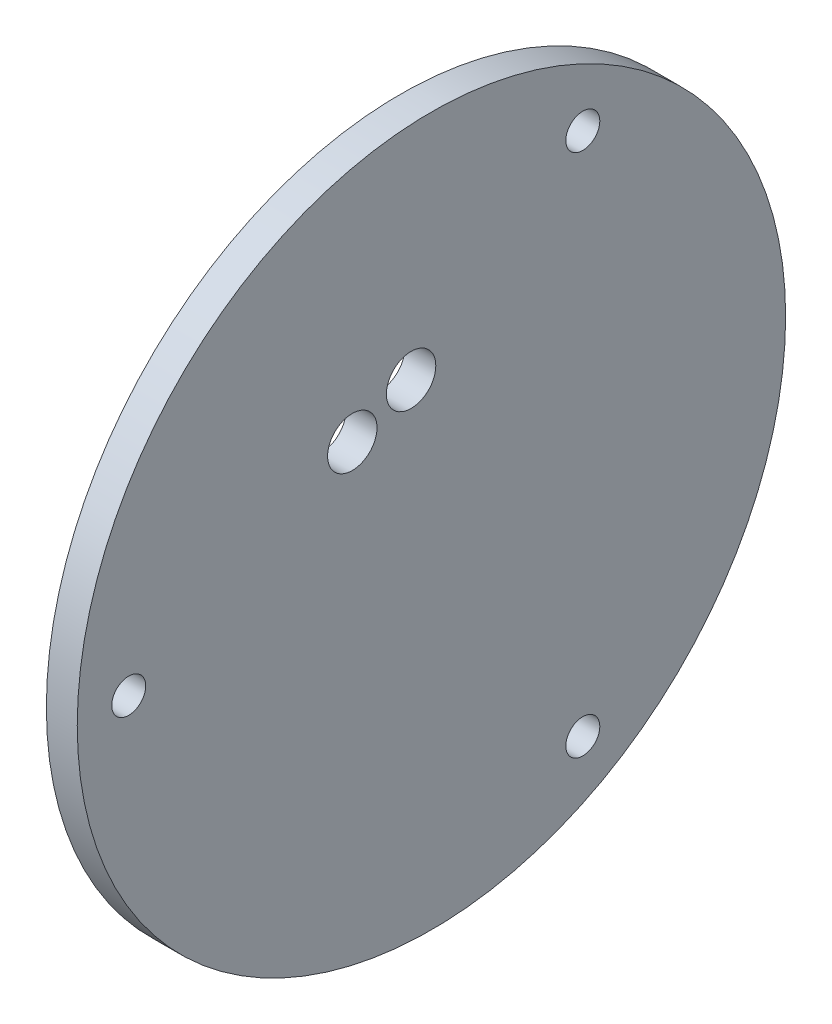
ISO-10303-21;
HEADER;
FILE_DESCRIPTION(('STEP AP214'),'2;1');
FILE_NAME('part.step','',(''),(''),'','','');
FILE_SCHEMA(('AUTOMOTIVE_DESIGN { 1 0 10303 214 1 1 1 1 }'));
ENDSEC;
DATA;
#1=APPLICATION_CONTEXT('core data for automotive mechanical design processes');
#2=APPLICATION_PROTOCOL_DEFINITION('international standard','automotive_design',2000,#1);
#3=PRODUCT_CONTEXT('',#1,'mechanical');
#4=PRODUCT('Part','Part','',(#3));
#5=PRODUCT_RELATED_PRODUCT_CATEGORY('part','',(#4));
#6=PRODUCT_DEFINITION_FORMATION('','',#4);
#7=PRODUCT_DEFINITION_CONTEXT('part definition',#1,'design');
#8=PRODUCT_DEFINITION('design','',#6,#7);
#9=PRODUCT_DEFINITION_SHAPE('','',#8);
#10=(LENGTH_UNIT() NAMED_UNIT(*) SI_UNIT(.MILLI.,.METRE.));
#11=(NAMED_UNIT(*) PLANE_ANGLE_UNIT() SI_UNIT($,.RADIAN.));
#12=(NAMED_UNIT(*) SI_UNIT($,.STERADIAN.) SOLID_ANGLE_UNIT());
#13=UNCERTAINTY_MEASURE_WITH_UNIT(LENGTH_MEASURE(1.E-05),#10,'distance_accuracy_value','');
#14=(GEOMETRIC_REPRESENTATION_CONTEXT(3) GLOBAL_UNCERTAINTY_ASSIGNED_CONTEXT((#13)) GLOBAL_UNIT_ASSIGNED_CONTEXT((#10,
#11,#12)) REPRESENTATION_CONTEXT('',''));
#15=CARTESIAN_POINT('',(0.,0.,0.));
#16=DIRECTION('',(0.,0.,1.));
#17=DIRECTION('',(1.,0.,0.));
#18=AXIS2_PLACEMENT_3D('',#15,#16,#17);
#19=CARTESIAN_POINT('',(156.7,34.4,0.));
#20=DIRECTION('',(1.,0.,0.));
#21=DIRECTION('',(0.,0.,-1.));
#22=AXIS2_PLACEMENT_3D('',#19,#20,#21);
#23=PLANE('',#22);
#24=CARTESIAN_POINT('',(156.7,25.4611468712625,-14.7));
#25=DIRECTION('',(1.,0.,0.));
#26=DIRECTION('',(0.,0.,-1.));
#27=AXIS2_PLACEMENT_3D('',#24,#25,#26);
#28=CIRCLE('',#27,1.65);
#29=CARTESIAN_POINT('',(156.7,25.4611468712625,-16.35));
#30=VERTEX_POINT('',#29);
#31=EDGE_CURVE('E41',#30,#30,#28,.F.);
#32=ORIENTED_EDGE('',*,*,#31,.F.);
#33=EDGE_LOOP('',(#32));
#34=FACE_BOUND('',#33,.T.);
#35=CARTESIAN_POINT('',(156.7,-25.4611468712625,-14.7));
#36=DIRECTION('',(1.,0.,0.));
#37=DIRECTION('',(0.,0.,-1.));
#38=AXIS2_PLACEMENT_3D('',#35,#36,#37);
#39=CIRCLE('',#38,1.65);
#40=CARTESIAN_POINT('',(156.7,-25.4611468712625,-16.35));
#41=VERTEX_POINT('',#40);
#42=EDGE_CURVE('E45',#41,#41,#39,.F.);
#43=ORIENTED_EDGE('',*,*,#42,.F.);
#44=EDGE_LOOP('',(#43));
#45=FACE_BOUND('',#44,.T.);
#46=CARTESIAN_POINT('',(156.7,0.,29.4));
#47=DIRECTION('',(1.,0.,0.));
#48=DIRECTION('',(0.,0.,-1.));
#49=AXIS2_PLACEMENT_3D('',#46,#47,#48);
#50=CIRCLE('',#49,1.65);
#51=CARTESIAN_POINT('',(156.7,0.,27.75));
#52=VERTEX_POINT('',#51);
#53=EDGE_CURVE('E50',#52,#52,#50,.F.);
#54=ORIENTED_EDGE('',*,*,#53,.F.);
#55=EDGE_LOOP('',(#54));
#56=FACE_BOUND('',#55,.T.);
#57=CARTESIAN_POINT('',(156.7,10.4836474229945,7.68720604058077));
#58=DIRECTION('',(1.,0.,0.));
#59=DIRECTION('',(0.,0.,-1.));
#60=AXIS2_PLACEMENT_3D('',#57,#58,#59);
#61=CIRCLE('',#60,2.4);
#62=CARTESIAN_POINT('',(156.7,10.4836474229945,5.28720604058077));
#63=VERTEX_POINT('',#62);
#64=EDGE_CURVE('E53',#63,#63,#61,.F.);
#65=ORIENTED_EDGE('',*,*,#64,.F.);
#66=EDGE_LOOP('',(#65));
#67=FACE_BOUND('',#66,.T.);
#68=CARTESIAN_POINT('',(156.7,12.8487337040411,1.97738266469541));
#69=DIRECTION('',(1.,0.,0.));
#70=DIRECTION('',(0.,0.,-1.));
#71=AXIS2_PLACEMENT_3D('',#68,#69,#70);
#72=CIRCLE('',#71,2.4);
#73=CARTESIAN_POINT('',(156.7,12.8487337040411,-0.422617335304591));
#74=VERTEX_POINT('',#73);
#75=EDGE_CURVE('E56',#74,#74,#72,.F.);
#76=ORIENTED_EDGE('',*,*,#75,.F.);
#77=EDGE_LOOP('',(#76));
#78=FACE_BOUND('',#77,.T.);
#79=CARTESIAN_POINT('',(156.7,0.,0.));
#80=DIRECTION('',(-1.,0.,0.));
#81=DIRECTION('',(0.,0.,1.));
#82=AXIS2_PLACEMENT_3D('',#79,#80,#81);
#83=CIRCLE('',#82,34.4);
#84=CARTESIAN_POINT('',(156.7,0.,34.4));
#85=VERTEX_POINT('',#84);
#86=EDGE_CURVE('E37',#85,#85,#83,.T.);
#87=ORIENTED_EDGE('',*,*,#86,.T.);
#88=EDGE_LOOP('',(#87));
#89=FACE_BOUND('',#88,.T.);
#90=ADVANCED_FACE('F31',(#34,#45,#56,#67,#78,#89),#23,.F.);
#91=CARTESIAN_POINT('',(159.7,0.,0.));
#92=DIRECTION('',(-1.,0.,0.));
#93=DIRECTION('',(0.,0.,1.));
#94=AXIS2_PLACEMENT_3D('',#91,#92,#93);
#95=PLANE('',#94);
#96=CARTESIAN_POINT('',(159.7,25.4611468712625,-14.7));
#97=DIRECTION('',(1.,0.,0.));
#98=DIRECTION('',(0.,0.,-1.));
#99=AXIS2_PLACEMENT_3D('',#96,#97,#98);
#100=CIRCLE('',#99,1.65);
#101=CARTESIAN_POINT('',(159.7,25.4611468712625,-16.35));
#102=VERTEX_POINT('',#101);
#103=EDGE_CURVE('E63',#102,#102,#100,.T.);
#104=ORIENTED_EDGE('',*,*,#103,.F.);
#105=EDGE_LOOP('',(#104));
#106=FACE_BOUND('',#105,.T.);
#107=CARTESIAN_POINT('',(159.7,-25.4611468712625,-14.7));
#108=DIRECTION('',(1.,0.,0.));
#109=DIRECTION('',(0.,0.,-1.));
#110=AXIS2_PLACEMENT_3D('',#107,#108,#109);
#111=CIRCLE('',#110,1.65);
#112=CARTESIAN_POINT('',(159.7,-25.4611468712625,-16.35));
#113=VERTEX_POINT('',#112);
#114=EDGE_CURVE('E66',#113,#113,#111,.T.);
#115=ORIENTED_EDGE('',*,*,#114,.F.);
#116=EDGE_LOOP('',(#115));
#117=FACE_BOUND('',#116,.T.);
#118=CARTESIAN_POINT('',(159.7,0.,29.4));
#119=DIRECTION('',(1.,0.,0.));
#120=DIRECTION('',(0.,0.,-1.));
#121=AXIS2_PLACEMENT_3D('',#118,#119,#120);
#122=CIRCLE('',#121,1.65);
#123=CARTESIAN_POINT('',(159.7,0.,27.75));
#124=VERTEX_POINT('',#123);
#125=EDGE_CURVE('E69',#124,#124,#122,.T.);
#126=ORIENTED_EDGE('',*,*,#125,.F.);
#127=EDGE_LOOP('',(#126));
#128=FACE_BOUND('',#127,.T.);
#129=CARTESIAN_POINT('',(159.7,10.4836474229945,7.68720604058077));
#130=DIRECTION('',(1.,0.,0.));
#131=DIRECTION('',(0.,0.,-1.));
#132=AXIS2_PLACEMENT_3D('',#129,#130,#131);
#133=CIRCLE('',#132,2.4);
#134=CARTESIAN_POINT('',(159.7,10.4836474229945,5.28720604058077));
#135=VERTEX_POINT('',#134);
#136=EDGE_CURVE('E62',#135,#135,#133,.T.);
#137=ORIENTED_EDGE('',*,*,#136,.F.);
#138=EDGE_LOOP('',(#137));
#139=FACE_BOUND('',#138,.T.);
#140=CARTESIAN_POINT('',(159.7,12.8487337040411,1.97738266469541));
#141=DIRECTION('',(1.,0.,0.));
#142=DIRECTION('',(0.,0.,-1.));
#143=AXIS2_PLACEMENT_3D('',#140,#141,#142);
#144=CIRCLE('',#143,2.4);
#145=CARTESIAN_POINT('',(159.7,12.8487337040411,-0.422617335304591));
#146=VERTEX_POINT('',#145);
#147=EDGE_CURVE('E59',#146,#146,#144,.T.);
#148=ORIENTED_EDGE('',*,*,#147,.F.);
#149=EDGE_LOOP('',(#148));
#150=FACE_BOUND('',#149,.T.);
#151=CARTESIAN_POINT('',(159.7,0.,0.));
#152=DIRECTION('',(-1.,0.,0.));
#153=DIRECTION('',(0.,0.,1.));
#154=AXIS2_PLACEMENT_3D('',#151,#152,#153);
#155=CIRCLE('',#154,34.4);
#156=CARTESIAN_POINT('',(159.7,0.,34.4));
#157=VERTEX_POINT('',#156);
#158=EDGE_CURVE('E10',#157,#157,#155,.T.);
#159=ORIENTED_EDGE('',*,*,#158,.F.);
#160=EDGE_LOOP('',(#159));
#161=FACE_BOUND('',#160,.T.);
#162=ADVANCED_FACE('F78',(#106,#117,#128,#139,#150,#161),#95,.F.);
#163=CARTESIAN_POINT('',(-110.,0.,0.));
#164=DIRECTION('',(-1.,0.,0.));
#165=DIRECTION('',(0.,0.,1.));
#166=AXIS2_PLACEMENT_3D('',#163,#164,#165);
#167=CYLINDRICAL_SURFACE('',#166,34.4);
#168=ORIENTED_EDGE('',*,*,#86,.F.);
#169=EDGE_LOOP('',(#168));
#170=FACE_BOUND('',#169,.T.);
#171=ORIENTED_EDGE('',*,*,#158,.T.);
#172=EDGE_LOOP('',(#171));
#173=FACE_BOUND('',#172,.T.);
#174=ADVANCED_FACE('F81',(#170,#173),#167,.T.);
#175=CARTESIAN_POINT('',(156.7,12.8487337040411,1.97738266469541));
#176=DIRECTION('',(-1.,0.,0.));
#177=DIRECTION('',(0.,0.,1.));
#178=AXIS2_PLACEMENT_3D('',#175,#176,#177);
#179=CYLINDRICAL_SURFACE('',#178,2.4);
#180=ORIENTED_EDGE('',*,*,#147,.T.);
#181=EDGE_LOOP('',(#180));
#182=FACE_BOUND('',#181,.T.);
#183=ORIENTED_EDGE('',*,*,#75,.T.);
#184=EDGE_LOOP('',(#183));
#185=FACE_BOUND('',#184,.T.);
#186=ADVANCED_FACE('F86',(#182,#185),#179,.F.);
#187=CARTESIAN_POINT('',(156.7,10.4836474229945,7.68720604058077));
#188=DIRECTION('',(-1.,0.,0.));
#189=DIRECTION('',(0.,0.,1.));
#190=AXIS2_PLACEMENT_3D('',#187,#188,#189);
#191=CYLINDRICAL_SURFACE('',#190,2.4);
#192=ORIENTED_EDGE('',*,*,#136,.T.);
#193=EDGE_LOOP('',(#192));
#194=FACE_BOUND('',#193,.T.);
#195=ORIENTED_EDGE('',*,*,#64,.T.);
#196=EDGE_LOOP('',(#195));
#197=FACE_BOUND('',#196,.T.);
#198=ADVANCED_FACE('F75',(#194,#197),#191,.F.);
#199=CARTESIAN_POINT('',(156.7,0.,29.4));
#200=DIRECTION('',(-1.,0.,0.));
#201=DIRECTION('',(0.,0.,1.));
#202=AXIS2_PLACEMENT_3D('',#199,#200,#201);
#203=CYLINDRICAL_SURFACE('',#202,1.65);
#204=ORIENTED_EDGE('',*,*,#125,.T.);
#205=EDGE_LOOP('',(#204));
#206=FACE_BOUND('',#205,.T.);
#207=ORIENTED_EDGE('',*,*,#53,.T.);
#208=EDGE_LOOP('',(#207));
#209=FACE_BOUND('',#208,.T.);
#210=ADVANCED_FACE('F104',(#206,#209),#203,.F.);
#211=CARTESIAN_POINT('',(156.7,-25.4611468712625,-14.7));
#212=DIRECTION('',(-1.,0.,0.));
#213=DIRECTION('',(0.,0.,1.));
#214=AXIS2_PLACEMENT_3D('',#211,#212,#213);
#215=CYLINDRICAL_SURFACE('',#214,1.65);
#216=ORIENTED_EDGE('',*,*,#114,.T.);
#217=EDGE_LOOP('',(#216));
#218=FACE_BOUND('',#217,.T.);
#219=ORIENTED_EDGE('',*,*,#42,.T.);
#220=EDGE_LOOP('',(#219));
#221=FACE_BOUND('',#220,.T.);
#222=ADVANCED_FACE('F109',(#218,#221),#215,.F.);
#223=CARTESIAN_POINT('',(156.7,25.4611468712625,-14.7));
#224=DIRECTION('',(-1.,0.,0.));
#225=DIRECTION('',(0.,0.,1.));
#226=AXIS2_PLACEMENT_3D('',#223,#224,#225);
#227=CYLINDRICAL_SURFACE('',#226,1.65);
#228=ORIENTED_EDGE('',*,*,#103,.T.);
#229=EDGE_LOOP('',(#228));
#230=FACE_BOUND('',#229,.T.);
#231=ORIENTED_EDGE('',*,*,#31,.T.);
#232=EDGE_LOOP('',(#231));
#233=FACE_BOUND('',#232,.T.);
#234=ADVANCED_FACE('F115',(#230,#233),#227,.F.);
#235=CLOSED_SHELL('',(#90,#162,#174,#186,#198,#210,#222,#234));
#236=MANIFOLD_SOLID_BREP('B2',#235);
#237=ADVANCED_BREP_SHAPE_REPRESENTATION('',(#18,#236),#14);
#238=SHAPE_DEFINITION_REPRESENTATION(#9,#237);
ENDSEC;
END-ISO-10303-21;
